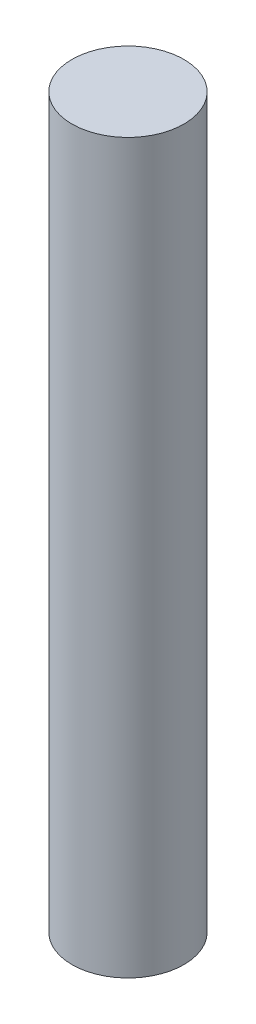
ISO-10303-21;
HEADER;
FILE_DESCRIPTION(('STEP AP214'),'2;1');
FILE_NAME('part.step','',(''),(''),'','','');
FILE_SCHEMA(('AUTOMOTIVE_DESIGN { 1 0 10303 214 1 1 1 1 }'));
ENDSEC;
DATA;
#1=APPLICATION_CONTEXT('core data for automotive mechanical design processes');
#2=APPLICATION_PROTOCOL_DEFINITION('international standard','automotive_design',2000,#1);
#3=PRODUCT_CONTEXT('',#1,'mechanical');
#4=PRODUCT('Part','Part','',(#3));
#5=PRODUCT_RELATED_PRODUCT_CATEGORY('part','',(#4));
#6=PRODUCT_DEFINITION_FORMATION('','',#4);
#7=PRODUCT_DEFINITION_CONTEXT('part definition',#1,'design');
#8=PRODUCT_DEFINITION('design','',#6,#7);
#9=PRODUCT_DEFINITION_SHAPE('','',#8);
#10=(LENGTH_UNIT() NAMED_UNIT(*) SI_UNIT(.MILLI.,.METRE.));
#11=(NAMED_UNIT(*) PLANE_ANGLE_UNIT() SI_UNIT($,.RADIAN.));
#12=(NAMED_UNIT(*) SI_UNIT($,.STERADIAN.) SOLID_ANGLE_UNIT());
#13=UNCERTAINTY_MEASURE_WITH_UNIT(LENGTH_MEASURE(1.E-05),#10,'distance_accuracy_value','');
#14=(GEOMETRIC_REPRESENTATION_CONTEXT(3) GLOBAL_UNCERTAINTY_ASSIGNED_CONTEXT((#13)) GLOBAL_UNIT_ASSIGNED_CONTEXT((#10,
#11,#12)) REPRESENTATION_CONTEXT('',''));
#15=CARTESIAN_POINT('',(0.,0.,0.));
#16=DIRECTION('',(0.,0.,1.));
#17=DIRECTION('',(1.,0.,0.));
#18=AXIS2_PLACEMENT_3D('',#15,#16,#17);
#19=CARTESIAN_POINT('',(0.,227.5,0.));
#20=DIRECTION('',(0.,-1.,0.));
#21=DIRECTION('',(0.,0.,-1.));
#22=AXIS2_PLACEMENT_3D('',#19,#20,#21);
#23=CYLINDRICAL_SURFACE('',#22,15.);
#24=CARTESIAN_POINT('',(0.,227.5,0.));
#25=DIRECTION('',(0.,1.,0.));
#26=DIRECTION('',(0.,0.,1.));
#27=AXIS2_PLACEMENT_3D('',#24,#25,#26);
#28=CIRCLE('',#27,15.);
#29=CARTESIAN_POINT('',(0.,227.5,15.));
#30=VERTEX_POINT('',#29);
#31=EDGE_CURVE('E11',#30,#30,#28,.T.);
#32=ORIENTED_EDGE('',*,*,#31,.F.);
#33=EDGE_LOOP('',(#32));
#34=FACE_BOUND('',#33,.T.);
#35=CARTESIAN_POINT('',(0.,32.5,0.));
#36=DIRECTION('',(0.,1.,0.));
#37=DIRECTION('',(0.,0.,1.));
#38=AXIS2_PLACEMENT_3D('',#35,#36,#37);
#39=CIRCLE('',#38,15.);
#40=CARTESIAN_POINT('',(0.,32.5,15.));
#41=VERTEX_POINT('',#40);
#42=EDGE_CURVE('E49',#41,#41,#39,.T.);
#43=ORIENTED_EDGE('',*,*,#42,.T.);
#44=EDGE_LOOP('',(#43));
#45=FACE_BOUND('',#44,.T.);
#46=ADVANCED_FACE('F50',(#34,#45),#23,.T.);
#47=CARTESIAN_POINT('',(0.,227.5,0.));
#48=DIRECTION('',(0.,1.,0.));
#49=DIRECTION('',(0.,0.,1.));
#50=AXIS2_PLACEMENT_3D('',#47,#48,#49);
#51=PLANE('',#50);
#52=ORIENTED_EDGE('',*,*,#31,.T.);
#53=EDGE_LOOP('',(#52));
#54=FACE_BOUND('',#53,.T.);
#55=ADVANCED_FACE('F62',(#54),#51,.T.);
#56=CARTESIAN_POINT('',(0.,32.5,0.));
#57=DIRECTION('',(0.,1.,0.));
#58=DIRECTION('',(0.,0.,1.));
#59=AXIS2_PLACEMENT_3D('',#56,#57,#58);
#60=PLANE('',#59);
#61=ORIENTED_EDGE('',*,*,#42,.F.);
#62=EDGE_LOOP('',(#61));
#63=FACE_BOUND('',#62,.T.);
#64=ADVANCED_FACE('F65',(#63),#60,.F.);
#65=CLOSED_SHELL('',(#46,#55,#64));
#66=MANIFOLD_SOLID_BREP('B2',#65);
#67=ADVANCED_BREP_SHAPE_REPRESENTATION('',(#18,#66),#14);
#68=SHAPE_DEFINITION_REPRESENTATION(#9,#67);
ENDSEC;
END-ISO-10303-21;
